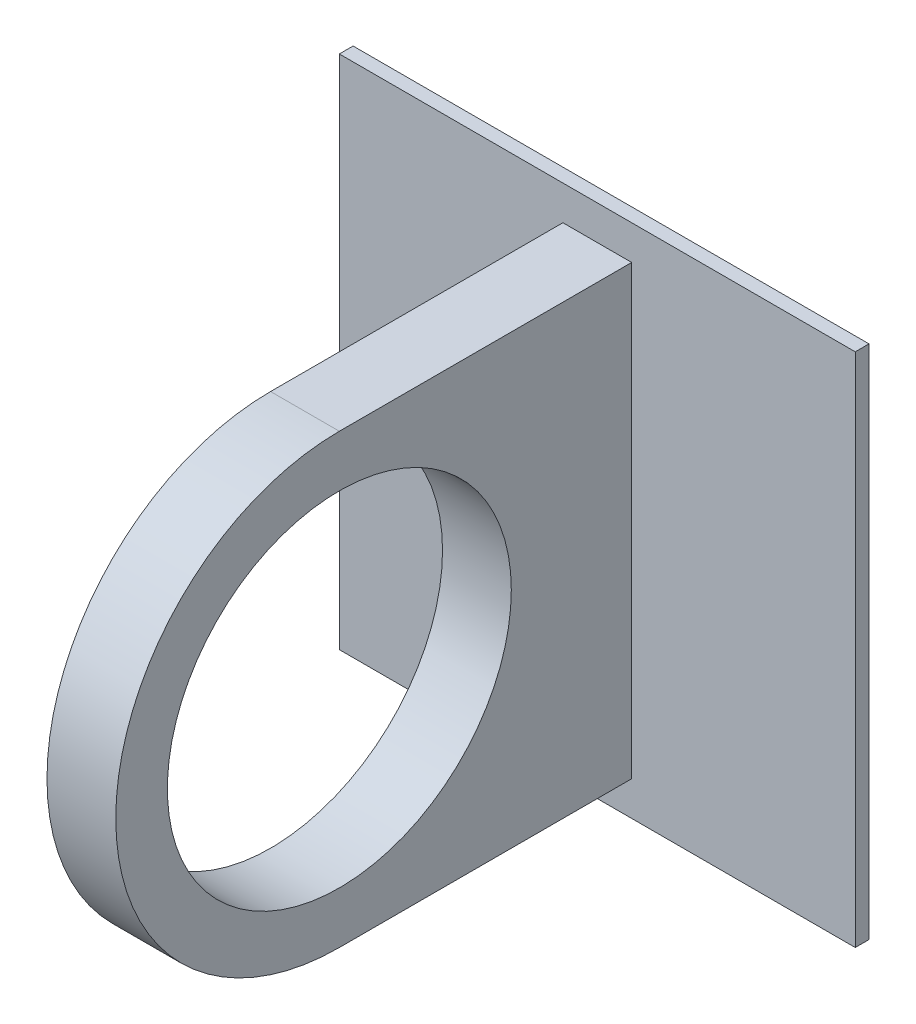
ISO-10303-21;
HEADER;
FILE_DESCRIPTION(('STEP AP214'),'2;1');
FILE_NAME('part.step','',(''),(''),'','','');
FILE_SCHEMA(('AUTOMOTIVE_DESIGN { 1 0 10303 214 1 1 1 1 }'));
ENDSEC;
DATA;
#1=APPLICATION_CONTEXT('core data for automotive mechanical design processes');
#2=APPLICATION_PROTOCOL_DEFINITION('international standard','automotive_design',2000,#1);
#3=PRODUCT_CONTEXT('',#1,'mechanical');
#4=PRODUCT('Part','Part','',(#3));
#5=PRODUCT_RELATED_PRODUCT_CATEGORY('part','',(#4));
#6=PRODUCT_DEFINITION_FORMATION('','',#4);
#7=PRODUCT_DEFINITION_CONTEXT('part definition',#1,'design');
#8=PRODUCT_DEFINITION('design','',#6,#7);
#9=PRODUCT_DEFINITION_SHAPE('','',#8);
#10=(LENGTH_UNIT() NAMED_UNIT(*) SI_UNIT(.MILLI.,.METRE.));
#11=(NAMED_UNIT(*) PLANE_ANGLE_UNIT() SI_UNIT($,.RADIAN.));
#12=(NAMED_UNIT(*) SI_UNIT($,.STERADIAN.) SOLID_ANGLE_UNIT());
#13=UNCERTAINTY_MEASURE_WITH_UNIT(LENGTH_MEASURE(1.E-05),#10,'distance_accuracy_value','');
#14=(GEOMETRIC_REPRESENTATION_CONTEXT(3) GLOBAL_UNCERTAINTY_ASSIGNED_CONTEXT((#13)) GLOBAL_UNIT_ASSIGNED_CONTEXT((#10,
#11,#12)) REPRESENTATION_CONTEXT('',''));
#15=CARTESIAN_POINT('',(0.,0.,0.));
#16=DIRECTION('',(0.,0.,1.));
#17=DIRECTION('',(1.,0.,0.));
#18=AXIS2_PLACEMENT_3D('',#15,#16,#17);
#19=CARTESIAN_POINT('',(1.27,-8.255,19.558));
#20=DIRECTION('',(-1.,0.,0.));
#21=DIRECTION('',(0.,0.,1.));
#22=AXIS2_PLACEMENT_3D('',#19,#20,#21);
#23=PLANE('',#22);
#24=CARTESIAN_POINT('',(1.27,0.,11.303));
#25=DIRECTION('',(1.,0.,0.));
#26=DIRECTION('',(0.,0.,-1.));
#27=AXIS2_PLACEMENT_3D('',#24,#25,#26);
#28=CIRCLE('',#27,6.35);
#29=CARTESIAN_POINT('',(1.27,0.,4.953));
#30=VERTEX_POINT('',#29);
#31=EDGE_CURVE('E276',#30,#30,#28,.T.);
#32=ORIENTED_EDGE('',*,*,#31,.F.);
#33=EDGE_LOOP('',(#32));
#34=FACE_BOUND('',#33,.T.);
#35=DIRECTION('',(0.,0.,-1.));
#36=VECTOR('',#35,1.);
#37=CARTESIAN_POINT('',(1.27,8.255,19.558));
#38=LINE('',#37,#36);
#39=CARTESIAN_POINT('',(1.27,8.255,11.303));
#40=VERTEX_POINT('',#39);
#41=CARTESIAN_POINT('',(1.27,8.255,0.508));
#42=VERTEX_POINT('',#41);
#43=EDGE_CURVE('E48',#40,#42,#38,.T.);
#44=ORIENTED_EDGE('',*,*,#43,.F.);
#45=CARTESIAN_POINT('',(1.27,0.,11.303));
#46=DIRECTION('',(1.,0.,0.));
#47=DIRECTION('',(0.,0.,-1.));
#48=AXIS2_PLACEMENT_3D('',#45,#46,#47);
#49=CIRCLE('',#48,8.255);
#50=CARTESIAN_POINT('',(1.27,-8.255,11.303));
#51=VERTEX_POINT('',#50);
#52=EDGE_CURVE('E105',#40,#51,#49,.T.);
#53=ORIENTED_EDGE('',*,*,#52,.T.);
#54=DIRECTION('',(0.,0.,-1.));
#55=VECTOR('',#54,1.);
#56=CARTESIAN_POINT('',(1.27,-8.255,19.558));
#57=LINE('',#56,#55);
#58=CARTESIAN_POINT('',(1.27,-8.255,0.508));
#59=VERTEX_POINT('',#58);
#60=EDGE_CURVE('E117',#51,#59,#57,.T.);
#61=ORIENTED_EDGE('',*,*,#60,.T.);
#62=DIRECTION('',(0.,1.,0.));
#63=VECTOR('',#62,1.);
#64=CARTESIAN_POINT('',(1.27,-8.255,0.508));
#65=LINE('',#64,#63);
#66=EDGE_CURVE('E283',#59,#42,#65,.T.);
#67=ORIENTED_EDGE('',*,*,#66,.T.);
#68=EDGE_LOOP('',(#44,#53,#61,#67));
#69=FACE_BOUND('',#68,.T.);
#70=ADVANCED_FACE('F33',(#34,#69),#23,.F.);
#71=CARTESIAN_POINT('',(-1.27,-8.255,19.558));
#72=DIRECTION('',(1.,0.,0.));
#73=DIRECTION('',(0.,0.,-1.));
#74=AXIS2_PLACEMENT_3D('',#71,#72,#73);
#75=PLANE('',#74);
#76=CARTESIAN_POINT('',(-1.27,0.,11.303));
#77=DIRECTION('',(1.,0.,0.));
#78=DIRECTION('',(0.,0.,-1.));
#79=AXIS2_PLACEMENT_3D('',#76,#77,#78);
#80=CIRCLE('',#79,6.35);
#81=CARTESIAN_POINT('',(-1.27,0.,4.953));
#82=VERTEX_POINT('',#81);
#83=EDGE_CURVE('E280',#82,#82,#80,.F.);
#84=ORIENTED_EDGE('',*,*,#83,.F.);
#85=EDGE_LOOP('',(#84));
#86=FACE_BOUND('',#85,.T.);
#87=CARTESIAN_POINT('',(-1.27,0.,11.303));
#88=DIRECTION('',(1.,0.,0.));
#89=DIRECTION('',(0.,0.,-1.));
#90=AXIS2_PLACEMENT_3D('',#87,#88,#89);
#91=CIRCLE('',#90,8.255);
#92=CARTESIAN_POINT('',(-1.27,-8.255,11.303));
#93=VERTEX_POINT('',#92);
#94=CARTESIAN_POINT('',(-1.27,8.255,11.303));
#95=VERTEX_POINT('',#94);
#96=EDGE_CURVE('E99',#93,#95,#91,.F.);
#97=ORIENTED_EDGE('',*,*,#96,.T.);
#98=DIRECTION('',(0.,0.,-1.));
#99=VECTOR('',#98,1.);
#100=CARTESIAN_POINT('',(-1.27,8.255,19.558));
#101=LINE('',#100,#99);
#102=CARTESIAN_POINT('',(-1.27,8.255,0.508));
#103=VERTEX_POINT('',#102);
#104=EDGE_CURVE('E56',#95,#103,#101,.T.);
#105=ORIENTED_EDGE('',*,*,#104,.T.);
#106=DIRECTION('',(0.,-1.,0.));
#107=VECTOR('',#106,1.);
#108=CARTESIAN_POINT('',(-1.27,-8.255,0.508));
#109=LINE('',#108,#107);
#110=CARTESIAN_POINT('',(-1.27,-8.255,0.508));
#111=VERTEX_POINT('',#110);
#112=EDGE_CURVE('E287',#103,#111,#109,.T.);
#113=ORIENTED_EDGE('',*,*,#112,.T.);
#114=DIRECTION('',(0.,0.,-1.));
#115=VECTOR('',#114,1.);
#116=CARTESIAN_POINT('',(-1.27,-8.255,19.558));
#117=LINE('',#116,#115);
#118=EDGE_CURVE('E102',#93,#111,#117,.T.);
#119=ORIENTED_EDGE('',*,*,#118,.F.);
#120=EDGE_LOOP('',(#97,#105,#113,#119));
#121=FACE_BOUND('',#120,.T.);
#122=ADVANCED_FACE('F101',(#86,#121),#75,.F.);
#123=CARTESIAN_POINT('',(-1.27,-8.255,19.558));
#124=DIRECTION('',(0.,1.,0.));
#125=DIRECTION('',(0.,0.,1.));
#126=AXIS2_PLACEMENT_3D('',#123,#124,#125);
#127=PLANE('',#126);
#128=DIRECTION('',(1.,0.,0.));
#129=VECTOR('',#128,1.);
#130=CARTESIAN_POINT('',(-9.526,-8.255,11.303));
#131=LINE('',#130,#129);
#132=EDGE_CURVE('E106',#51,#93,#131,.F.);
#133=ORIENTED_EDGE('',*,*,#132,.T.);
#134=ORIENTED_EDGE('',*,*,#118,.T.);
#135=DIRECTION('',(1.,0.,0.));
#136=VECTOR('',#135,1.);
#137=CARTESIAN_POINT('',(-1.27,-8.255,0.508));
#138=LINE('',#137,#136);
#139=EDGE_CURVE('E289',#111,#59,#138,.T.);
#140=ORIENTED_EDGE('',*,*,#139,.T.);
#141=ORIENTED_EDGE('',*,*,#60,.F.);
#142=EDGE_LOOP('',(#133,#134,#140,#141));
#143=FACE_BOUND('',#142,.T.);
#144=ADVANCED_FACE('F178',(#143),#127,.F.);
#145=CARTESIAN_POINT('',(0.,0.,0.508));
#146=DIRECTION('',(0.,0.,-1.));
#147=DIRECTION('',(-1.,0.,0.));
#148=AXIS2_PLACEMENT_3D('',#145,#146,#147);
#149=PLANE('',#148);
#150=DIRECTION('',(0.,1.,0.));
#151=VECTOR('',#150,1.);
#152=CARTESIAN_POINT('',(9.525,-9.525,0.508));
#153=LINE('',#152,#151);
#154=CARTESIAN_POINT('',(9.525,-9.525,0.508));
#155=VERTEX_POINT('',#154);
#156=CARTESIAN_POINT('',(9.525,9.525,0.508));
#157=VERTEX_POINT('',#156);
#158=EDGE_CURVE('E121',#155,#157,#153,.T.);
#159=ORIENTED_EDGE('',*,*,#158,.T.);
#160=DIRECTION('',(-1.,0.,0.));
#161=VECTOR('',#160,1.);
#162=CARTESIAN_POINT('',(-9.525,9.525,0.508));
#163=LINE('',#162,#161);
#164=CARTESIAN_POINT('',(-9.525,9.525,0.508));
#165=VERTEX_POINT('',#164);
#166=EDGE_CURVE('E124',#157,#165,#163,.T.);
#167=ORIENTED_EDGE('',*,*,#166,.T.);
#168=DIRECTION('',(0.,-1.,0.));
#169=VECTOR('',#168,1.);
#170=CARTESIAN_POINT('',(-9.525,-9.525,0.508));
#171=LINE('',#170,#169);
#172=CARTESIAN_POINT('',(-9.525,-9.525,0.508));
#173=VERTEX_POINT('',#172);
#174=EDGE_CURVE('E127',#165,#173,#171,.T.);
#175=ORIENTED_EDGE('',*,*,#174,.T.);
#176=DIRECTION('',(1.,0.,0.));
#177=VECTOR('',#176,1.);
#178=CARTESIAN_POINT('',(-9.525,-9.525,0.508));
#179=LINE('',#178,#177);
#180=EDGE_CURVE('E129',#173,#155,#179,.T.);
#181=ORIENTED_EDGE('',*,*,#180,.T.);
#182=EDGE_LOOP('',(#159,#167,#175,#181));
#183=FACE_BOUND('',#182,.T.);
#184=ORIENTED_EDGE('',*,*,#66,.F.);
#185=ORIENTED_EDGE('',*,*,#139,.F.);
#186=ORIENTED_EDGE('',*,*,#112,.F.);
#187=DIRECTION('',(-1.,0.,0.));
#188=VECTOR('',#187,1.);
#189=CARTESIAN_POINT('',(-1.27,8.255,0.508));
#190=LINE('',#189,#188);
#191=EDGE_CURVE('E113',#42,#103,#190,.T.);
#192=ORIENTED_EDGE('',*,*,#191,.F.);
#193=EDGE_LOOP('',(#184,#185,#186,#192));
#194=FACE_BOUND('',#193,.T.);
#195=ADVANCED_FACE('F163',(#183,#194),#149,.F.);
#196=CARTESIAN_POINT('',(9.525,-9.525,0.508));
#197=DIRECTION('',(-1.,0.,0.));
#198=DIRECTION('',(0.,0.,1.));
#199=AXIS2_PLACEMENT_3D('',#196,#197,#198);
#200=PLANE('',#199);
#201=DIRECTION('',(0.,1.,0.));
#202=VECTOR('',#201,1.);
#203=CARTESIAN_POINT('',(9.525,-9.525,0.));
#204=LINE('',#203,#202);
#205=CARTESIAN_POINT('',(9.525,-9.525,0.));
#206=VERTEX_POINT('',#205);
#207=CARTESIAN_POINT('',(9.525,9.525,0.));
#208=VERTEX_POINT('',#207);
#209=EDGE_CURVE('E115',#206,#208,#204,.T.);
#210=ORIENTED_EDGE('',*,*,#209,.T.);
#211=DIRECTION('',(0.,0.,-1.));
#212=VECTOR('',#211,1.);
#213=CARTESIAN_POINT('',(9.525,9.525,0.508));
#214=LINE('',#213,#212);
#215=EDGE_CURVE('E11',#157,#208,#214,.T.);
#216=ORIENTED_EDGE('',*,*,#215,.F.);
#217=ORIENTED_EDGE('',*,*,#158,.F.);
#218=DIRECTION('',(0.,0.,-1.));
#219=VECTOR('',#218,1.);
#220=CARTESIAN_POINT('',(9.525,-9.525,0.508));
#221=LINE('',#220,#219);
#222=EDGE_CURVE('E131',#155,#206,#221,.T.);
#223=ORIENTED_EDGE('',*,*,#222,.T.);
#224=EDGE_LOOP('',(#210,#216,#217,#223));
#225=FACE_BOUND('',#224,.T.);
#226=ADVANCED_FACE('F35',(#225),#200,.F.);
#227=CARTESIAN_POINT('',(-9.525,9.525,0.508));
#228=DIRECTION('',(0.,-1.,0.));
#229=DIRECTION('',(0.,0.,-1.));
#230=AXIS2_PLACEMENT_3D('',#227,#228,#229);
#231=PLANE('',#230);
#232=DIRECTION('',(-1.,0.,0.));
#233=VECTOR('',#232,1.);
#234=CARTESIAN_POINT('',(-9.525,9.525,0.));
#235=LINE('',#234,#233);
#236=CARTESIAN_POINT('',(-9.525,9.525,0.));
#237=VERTEX_POINT('',#236);
#238=EDGE_CURVE('E134',#208,#237,#235,.T.);
#239=ORIENTED_EDGE('',*,*,#238,.T.);
#240=DIRECTION('',(0.,0.,-1.));
#241=VECTOR('',#240,1.);
#242=CARTESIAN_POINT('',(-9.525,9.525,0.508));
#243=LINE('',#242,#241);
#244=EDGE_CURVE('E41',#165,#237,#243,.T.);
#245=ORIENTED_EDGE('',*,*,#244,.F.);
#246=ORIENTED_EDGE('',*,*,#166,.F.);
#247=ORIENTED_EDGE('',*,*,#215,.T.);
#248=EDGE_LOOP('',(#239,#245,#246,#247));
#249=FACE_BOUND('',#248,.T.);
#250=ADVANCED_FACE('F165',(#249),#231,.F.);
#251=CARTESIAN_POINT('',(-9.525,-9.525,0.508));
#252=DIRECTION('',(1.,0.,0.));
#253=DIRECTION('',(0.,0.,-1.));
#254=AXIS2_PLACEMENT_3D('',#251,#252,#253);
#255=PLANE('',#254);
#256=DIRECTION('',(0.,-1.,0.));
#257=VECTOR('',#256,1.);
#258=CARTESIAN_POINT('',(-9.525,-9.525,0.));
#259=LINE('',#258,#257);
#260=CARTESIAN_POINT('',(-9.525,-9.525,0.));
#261=VERTEX_POINT('',#260);
#262=EDGE_CURVE('E136',#237,#261,#259,.T.);
#263=ORIENTED_EDGE('',*,*,#262,.T.);
#264=DIRECTION('',(0.,0.,-1.));
#265=VECTOR('',#264,1.);
#266=CARTESIAN_POINT('',(-9.525,-9.525,0.508));
#267=LINE('',#266,#265);
#268=EDGE_CURVE('E141',#173,#261,#267,.T.);
#269=ORIENTED_EDGE('',*,*,#268,.F.);
#270=ORIENTED_EDGE('',*,*,#174,.F.);
#271=ORIENTED_EDGE('',*,*,#244,.T.);
#272=EDGE_LOOP('',(#263,#269,#270,#271));
#273=FACE_BOUND('',#272,.T.);
#274=ADVANCED_FACE('F148',(#273),#255,.F.);
#275=CARTESIAN_POINT('',(-9.525,-9.525,0.508));
#276=DIRECTION('',(0.,1.,0.));
#277=DIRECTION('',(0.,0.,1.));
#278=AXIS2_PLACEMENT_3D('',#275,#276,#277);
#279=PLANE('',#278);
#280=DIRECTION('',(1.,0.,0.));
#281=VECTOR('',#280,1.);
#282=CARTESIAN_POINT('',(-9.525,-9.525,0.));
#283=LINE('',#282,#281);
#284=EDGE_CURVE('E125',#261,#206,#283,.T.);
#285=ORIENTED_EDGE('',*,*,#284,.T.);
#286=ORIENTED_EDGE('',*,*,#222,.F.);
#287=ORIENTED_EDGE('',*,*,#180,.F.);
#288=ORIENTED_EDGE('',*,*,#268,.T.);
#289=EDGE_LOOP('',(#285,#286,#287,#288));
#290=FACE_BOUND('',#289,.T.);
#291=ADVANCED_FACE('F157',(#290),#279,.F.);
#292=CARTESIAN_POINT('',(0.,0.,0.));
#293=DIRECTION('',(0.,0.,-1.));
#294=DIRECTION('',(-1.,0.,0.));
#295=AXIS2_PLACEMENT_3D('',#292,#293,#294);
#296=PLANE('',#295);
#297=ORIENTED_EDGE('',*,*,#209,.F.);
#298=ORIENTED_EDGE('',*,*,#284,.F.);
#299=ORIENTED_EDGE('',*,*,#262,.F.);
#300=ORIENTED_EDGE('',*,*,#238,.F.);
#301=EDGE_LOOP('',(#297,#298,#299,#300));
#302=FACE_BOUND('',#301,.T.);
#303=ADVANCED_FACE('F154',(#302),#296,.T.);
#304=CARTESIAN_POINT('',(-1.27,8.255,19.558));
#305=DIRECTION('',(0.,-1.,0.));
#306=DIRECTION('',(0.,0.,-1.));
#307=AXIS2_PLACEMENT_3D('',#304,#305,#306);
#308=PLANE('',#307);
#309=ORIENTED_EDGE('',*,*,#104,.F.);
#310=DIRECTION('',(1.,0.,0.));
#311=VECTOR('',#310,1.);
#312=CARTESIAN_POINT('',(-9.526,8.255,11.303));
#313=LINE('',#312,#311);
#314=EDGE_CURVE('E108',#40,#95,#313,.F.);
#315=ORIENTED_EDGE('',*,*,#314,.F.);
#316=ORIENTED_EDGE('',*,*,#43,.T.);
#317=ORIENTED_EDGE('',*,*,#191,.T.);
#318=EDGE_LOOP('',(#309,#315,#316,#317));
#319=FACE_BOUND('',#318,.T.);
#320=ADVANCED_FACE('F112',(#319),#308,.F.);
#321=CARTESIAN_POINT('',(-9.526,0.,11.303));
#322=DIRECTION('',(1.,0.,0.));
#323=DIRECTION('',(0.,0.,-1.));
#324=AXIS2_PLACEMENT_3D('',#321,#322,#323);
#325=CYLINDRICAL_SURFACE('',#324,6.35);
#326=ORIENTED_EDGE('',*,*,#31,.T.);
#327=EDGE_LOOP('',(#326));
#328=FACE_BOUND('',#327,.T.);
#329=ORIENTED_EDGE('',*,*,#83,.T.);
#330=EDGE_LOOP('',(#329));
#331=FACE_BOUND('',#330,.T.);
#332=ADVANCED_FACE('F205',(#328,#331),#325,.F.);
#333=CARTESIAN_POINT('',(-9.526,0.,11.303));
#334=DIRECTION('',(1.,0.,0.));
#335=DIRECTION('',(0.,0.,-1.));
#336=AXIS2_PLACEMENT_3D('',#333,#334,#335);
#337=CYLINDRICAL_SURFACE('',#336,8.255);
#338=ORIENTED_EDGE('',*,*,#132,.F.);
#339=ORIENTED_EDGE('',*,*,#52,.F.);
#340=ORIENTED_EDGE('',*,*,#314,.T.);
#341=ORIENTED_EDGE('',*,*,#96,.F.);
#342=EDGE_LOOP('',(#338,#339,#340,#341));
#343=FACE_BOUND('',#342,.T.);
#344=ADVANCED_FACE('F109',(#343),#337,.T.);
#345=CLOSED_SHELL('',(#70,#122,#144,#195,#226,#250,#274,#291,#303,#320,#332,#344));
#346=MANIFOLD_SOLID_BREP('B2',#345);
#347=ADVANCED_BREP_SHAPE_REPRESENTATION('',(#18,#346),#14);
#348=SHAPE_DEFINITION_REPRESENTATION(#9,#347);
ENDSEC;
END-ISO-10303-21;
